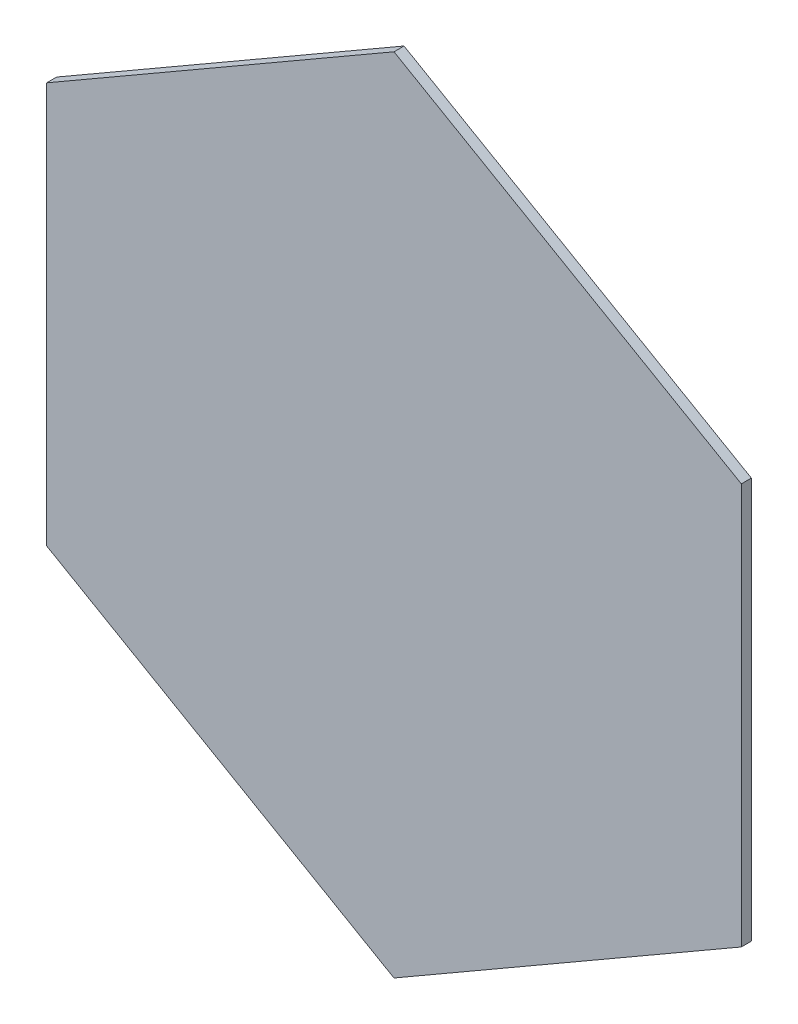
ISO-10303-21;
HEADER;
FILE_DESCRIPTION(('STEP AP214'),'2;1');
FILE_NAME('part.step','',(''),(''),'','','');
FILE_SCHEMA(('AUTOMOTIVE_DESIGN { 1 0 10303 214 1 1 1 1 }'));
ENDSEC;
DATA;
#1=APPLICATION_CONTEXT('core data for automotive mechanical design processes');
#2=APPLICATION_PROTOCOL_DEFINITION('international standard','automotive_design',2000,#1);
#3=PRODUCT_CONTEXT('',#1,'mechanical');
#4=PRODUCT('Part','Part','',(#3));
#5=PRODUCT_RELATED_PRODUCT_CATEGORY('part','',(#4));
#6=PRODUCT_DEFINITION_FORMATION('','',#4);
#7=PRODUCT_DEFINITION_CONTEXT('part definition',#1,'design');
#8=PRODUCT_DEFINITION('design','',#6,#7);
#9=PRODUCT_DEFINITION_SHAPE('','',#8);
#10=(LENGTH_UNIT() NAMED_UNIT(*) SI_UNIT(.MILLI.,.METRE.));
#11=(NAMED_UNIT(*) PLANE_ANGLE_UNIT() SI_UNIT($,.RADIAN.));
#12=(NAMED_UNIT(*) SI_UNIT($,.STERADIAN.) SOLID_ANGLE_UNIT());
#13=UNCERTAINTY_MEASURE_WITH_UNIT(LENGTH_MEASURE(1.E-05),#10,'distance_accuracy_value','');
#14=(GEOMETRIC_REPRESENTATION_CONTEXT(3) GLOBAL_UNCERTAINTY_ASSIGNED_CONTEXT((#13)) GLOBAL_UNIT_ASSIGNED_CONTEXT((#10,
#11,#12)) REPRESENTATION_CONTEXT('',''));
#15=CARTESIAN_POINT('',(0.,0.,0.));
#16=DIRECTION('',(0.,0.,1.));
#17=DIRECTION('',(1.,0.,0.));
#18=AXIS2_PLACEMENT_3D('',#15,#16,#17);
#19=CARTESIAN_POINT('',(103.923048454133,60.0000000000001,3.));
#20=DIRECTION('',(-0.5,-0.866025403784439,0.));
#21=DIRECTION('',(0.866025403784439,-0.5,0.));
#22=AXIS2_PLACEMENT_3D('',#19,#20,#21);
#23=PLANE('',#22);
#24=DIRECTION('',(-0.866025403784439,0.5,0.));
#25=VECTOR('',#24,1.);
#26=CARTESIAN_POINT('',(103.923048454133,60.0000000000001,0.));
#27=LINE('',#26,#25);
#28=CARTESIAN_POINT('',(103.923048454133,60.0000000000001,0.));
#29=VERTEX_POINT('',#28);
#30=CARTESIAN_POINT('',(0.,120.,0.));
#31=VERTEX_POINT('',#30);
#32=EDGE_CURVE('E120',#29,#31,#27,.T.);
#33=ORIENTED_EDGE('',*,*,#32,.T.);
#34=DIRECTION('',(0.,0.,-1.));
#35=VECTOR('',#34,1.);
#36=CARTESIAN_POINT('',(0.,120.,3.));
#37=LINE('',#36,#35);
#38=CARTESIAN_POINT('',(0.,120.,3.));
#39=VERTEX_POINT('',#38);
#40=EDGE_CURVE('E11',#39,#31,#37,.T.);
#41=ORIENTED_EDGE('',*,*,#40,.F.);
#42=DIRECTION('',(-0.866025403784439,0.5,0.));
#43=VECTOR('',#42,1.);
#44=CARTESIAN_POINT('',(103.923048454133,60.0000000000001,3.));
#45=LINE('',#44,#43);
#46=CARTESIAN_POINT('',(103.923048454133,60.0000000000001,3.));
#47=VERTEX_POINT('',#46);
#48=EDGE_CURVE('E130',#47,#39,#45,.T.);
#49=ORIENTED_EDGE('',*,*,#48,.F.);
#50=DIRECTION('',(0.,0.,-1.));
#51=VECTOR('',#50,1.);
#52=CARTESIAN_POINT('',(103.923048454133,60.0000000000001,3.));
#53=LINE('',#52,#51);
#54=EDGE_CURVE('E116',#47,#29,#53,.T.);
#55=ORIENTED_EDGE('',*,*,#54,.T.);
#56=EDGE_LOOP('',(#33,#41,#49,#55));
#57=FACE_BOUND('',#56,.T.);
#58=ADVANCED_FACE('F36',(#57),#23,.F.);
#59=CARTESIAN_POINT('',(0.,120.,3.));
#60=DIRECTION('',(0.5,-0.866025403784438,0.));
#61=DIRECTION('',(0.866025403784439,0.5,0.));
#62=AXIS2_PLACEMENT_3D('',#59,#60,#61);
#63=PLANE('',#62);
#64=DIRECTION('',(-0.866025403784439,-0.5,0.));
#65=VECTOR('',#64,1.);
#66=CARTESIAN_POINT('',(0.,120.,0.));
#67=LINE('',#66,#65);
#68=CARTESIAN_POINT('',(-103.923048454133,60.,0.));
#69=VERTEX_POINT('',#68);
#70=EDGE_CURVE('E123',#31,#69,#67,.T.);
#71=ORIENTED_EDGE('',*,*,#70,.T.);
#72=DIRECTION('',(0.,0.,-1.));
#73=VECTOR('',#72,1.);
#74=CARTESIAN_POINT('',(-103.923048454133,60.,3.));
#75=LINE('',#74,#73);
#76=CARTESIAN_POINT('',(-103.923048454133,60.,3.));
#77=VERTEX_POINT('',#76);
#78=EDGE_CURVE('E44',#77,#69,#75,.T.);
#79=ORIENTED_EDGE('',*,*,#78,.F.);
#80=DIRECTION('',(-0.866025403784439,-0.5,0.));
#81=VECTOR('',#80,1.);
#82=CARTESIAN_POINT('',(0.,120.,3.));
#83=LINE('',#82,#81);
#84=EDGE_CURVE('E89',#39,#77,#83,.T.);
#85=ORIENTED_EDGE('',*,*,#84,.F.);
#86=ORIENTED_EDGE('',*,*,#40,.T.);
#87=EDGE_LOOP('',(#71,#79,#85,#86));
#88=FACE_BOUND('',#87,.T.);
#89=ADVANCED_FACE('F154',(#88),#63,.F.);
#90=CARTESIAN_POINT('',(-103.923048454133,60.,3.));
#91=DIRECTION('',(1.,0.,0.));
#92=DIRECTION('',(0.,1.,0.));
#93=AXIS2_PLACEMENT_3D('',#90,#91,#92);
#94=PLANE('',#93);
#95=DIRECTION('',(0.,-1.,0.));
#96=VECTOR('',#95,1.);
#97=CARTESIAN_POINT('',(-103.923048454133,60.,0.));
#98=LINE('',#97,#96);
#99=CARTESIAN_POINT('',(-103.923048454133,-60.0000000000001,0.));
#100=VERTEX_POINT('',#99);
#101=EDGE_CURVE('E125',#69,#100,#98,.T.);
#102=ORIENTED_EDGE('',*,*,#101,.T.);
#103=DIRECTION('',(0.,0.,-1.));
#104=VECTOR('',#103,1.);
#105=CARTESIAN_POINT('',(-103.923048454133,-60.0000000000001,3.));
#106=LINE('',#105,#104);
#107=CARTESIAN_POINT('',(-103.923048454133,-60.0000000000001,3.));
#108=VERTEX_POINT('',#107);
#109=EDGE_CURVE('E111',#108,#100,#106,.T.);
#110=ORIENTED_EDGE('',*,*,#109,.F.);
#111=DIRECTION('',(0.,-1.,0.));
#112=VECTOR('',#111,1.);
#113=CARTESIAN_POINT('',(-103.923048454133,60.,3.));
#114=LINE('',#113,#112);
#115=EDGE_CURVE('E102',#77,#108,#114,.T.);
#116=ORIENTED_EDGE('',*,*,#115,.F.);
#117=ORIENTED_EDGE('',*,*,#78,.T.);
#118=EDGE_LOOP('',(#102,#110,#116,#117));
#119=FACE_BOUND('',#118,.T.);
#120=ADVANCED_FACE('F136',(#119),#94,.F.);
#121=CARTESIAN_POINT('',(-103.923048454133,-60.0000000000001,3.));
#122=DIRECTION('',(0.5,0.866025403784439,0.));
#123=DIRECTION('',(-0.866025403784439,0.5,0.));
#124=AXIS2_PLACEMENT_3D('',#121,#122,#123);
#125=PLANE('',#124);
#126=DIRECTION('',(0.866025403784439,-0.5,0.));
#127=VECTOR('',#126,1.);
#128=CARTESIAN_POINT('',(-103.923048454133,-60.0000000000001,0.));
#129=LINE('',#128,#127);
#130=CARTESIAN_POINT('',(0.,-120.,0.));
#131=VERTEX_POINT('',#130);
#132=EDGE_CURVE('E110',#100,#131,#129,.T.);
#133=ORIENTED_EDGE('',*,*,#132,.T.);
#134=DIRECTION('',(0.,0.,-1.));
#135=VECTOR('',#134,1.);
#136=CARTESIAN_POINT('',(0.,-120.,3.));
#137=LINE('',#136,#135);
#138=CARTESIAN_POINT('',(0.,-120.,3.));
#139=VERTEX_POINT('',#138);
#140=EDGE_CURVE('E107',#139,#131,#137,.T.);
#141=ORIENTED_EDGE('',*,*,#140,.F.);
#142=DIRECTION('',(0.866025403784439,-0.5,0.));
#143=VECTOR('',#142,1.);
#144=CARTESIAN_POINT('',(-103.923048454133,-60.0000000000001,3.));
#145=LINE('',#144,#143);
#146=EDGE_CURVE('E96',#108,#139,#145,.T.);
#147=ORIENTED_EDGE('',*,*,#146,.F.);
#148=ORIENTED_EDGE('',*,*,#109,.T.);
#149=EDGE_LOOP('',(#133,#141,#147,#148));
#150=FACE_BOUND('',#149,.T.);
#151=ADVANCED_FACE('F108',(#150),#125,.F.);
#152=CARTESIAN_POINT('',(0.,-120.,3.));
#153=DIRECTION('',(-0.5,0.866025403784439,0.));
#154=DIRECTION('',(-0.866025403784439,-0.5,0.));
#155=AXIS2_PLACEMENT_3D('',#152,#153,#154);
#156=PLANE('',#155);
#157=DIRECTION('',(0.866025403784438,0.5,0.));
#158=VECTOR('',#157,1.);
#159=CARTESIAN_POINT('',(0.,-120.,0.));
#160=LINE('',#159,#158);
#161=CARTESIAN_POINT('',(103.923048454133,-60.,0.));
#162=VERTEX_POINT('',#161);
#163=EDGE_CURVE('E75',#131,#162,#160,.T.);
#164=ORIENTED_EDGE('',*,*,#163,.T.);
#165=DIRECTION('',(0.,0.,-1.));
#166=VECTOR('',#165,1.);
#167=CARTESIAN_POINT('',(103.923048454133,-60.,3.));
#168=LINE('',#167,#166);
#169=CARTESIAN_POINT('',(103.923048454133,-60.,3.));
#170=VERTEX_POINT('',#169);
#171=EDGE_CURVE('E112',#170,#162,#168,.T.);
#172=ORIENTED_EDGE('',*,*,#171,.F.);
#173=DIRECTION('',(0.866025403784438,0.5,0.));
#174=VECTOR('',#173,1.);
#175=CARTESIAN_POINT('',(0.,-120.,3.));
#176=LINE('',#175,#174);
#177=EDGE_CURVE('E100',#139,#170,#176,.T.);
#178=ORIENTED_EDGE('',*,*,#177,.F.);
#179=ORIENTED_EDGE('',*,*,#140,.T.);
#180=EDGE_LOOP('',(#164,#172,#178,#179));
#181=FACE_BOUND('',#180,.T.);
#182=ADVANCED_FACE('F114',(#181),#156,.F.);
#183=CARTESIAN_POINT('',(103.923048454133,-60.,3.));
#184=DIRECTION('',(-1.,0.,0.));
#185=DIRECTION('',(0.,0.,1.));
#186=AXIS2_PLACEMENT_3D('',#183,#184,#185);
#187=PLANE('',#186);
#188=DIRECTION('',(0.,1.,0.));
#189=VECTOR('',#188,1.);
#190=CARTESIAN_POINT('',(103.923048454133,-60.,0.));
#191=LINE('',#190,#189);
#192=EDGE_CURVE('E81',#162,#29,#191,.T.);
#193=ORIENTED_EDGE('',*,*,#192,.T.);
#194=ORIENTED_EDGE('',*,*,#54,.F.);
#195=DIRECTION('',(0.,1.,0.));
#196=VECTOR('',#195,1.);
#197=CARTESIAN_POINT('',(103.923048454133,-60.,3.));
#198=LINE('',#197,#196);
#199=EDGE_CURVE('E52',#170,#47,#198,.T.);
#200=ORIENTED_EDGE('',*,*,#199,.F.);
#201=ORIENTED_EDGE('',*,*,#171,.T.);
#202=EDGE_LOOP('',(#193,#194,#200,#201));
#203=FACE_BOUND('',#202,.T.);
#204=ADVANCED_FACE('F143',(#203),#187,.F.);
#205=CARTESIAN_POINT('',(0.,0.,3.));
#206=DIRECTION('',(0.,0.,1.));
#207=DIRECTION('',(1.,0.,0.));
#208=AXIS2_PLACEMENT_3D('',#205,#206,#207);
#209=PLANE('',#208);
#210=ORIENTED_EDGE('',*,*,#48,.T.);
#211=ORIENTED_EDGE('',*,*,#84,.T.);
#212=ORIENTED_EDGE('',*,*,#115,.T.);
#213=ORIENTED_EDGE('',*,*,#146,.T.);
#214=ORIENTED_EDGE('',*,*,#177,.T.);
#215=ORIENTED_EDGE('',*,*,#199,.T.);
#216=EDGE_LOOP('',(#210,#211,#212,#213,#214,#215));
#217=FACE_BOUND('',#216,.T.);
#218=ADVANCED_FACE('F98',(#217),#209,.T.);
#219=CARTESIAN_POINT('',(0.,0.,0.));
#220=DIRECTION('',(0.,0.,1.));
#221=DIRECTION('',(1.,0.,0.));
#222=AXIS2_PLACEMENT_3D('',#219,#220,#221);
#223=PLANE('',#222);
#224=ORIENTED_EDGE('',*,*,#32,.F.);
#225=ORIENTED_EDGE('',*,*,#192,.F.);
#226=ORIENTED_EDGE('',*,*,#163,.F.);
#227=ORIENTED_EDGE('',*,*,#132,.F.);
#228=ORIENTED_EDGE('',*,*,#101,.F.);
#229=ORIENTED_EDGE('',*,*,#70,.F.);
#230=EDGE_LOOP('',(#224,#225,#226,#227,#228,#229));
#231=FACE_BOUND('',#230,.T.);
#232=ADVANCED_FACE('F139',(#231),#223,.F.);
#233=CLOSED_SHELL('',(#58,#89,#120,#151,#182,#204,#218,#232));
#234=MANIFOLD_SOLID_BREP('B2',#233);
#235=ADVANCED_BREP_SHAPE_REPRESENTATION('',(#18,#234),#14);
#236=SHAPE_DEFINITION_REPRESENTATION(#9,#235);
ENDSEC;
END-ISO-10303-21;
